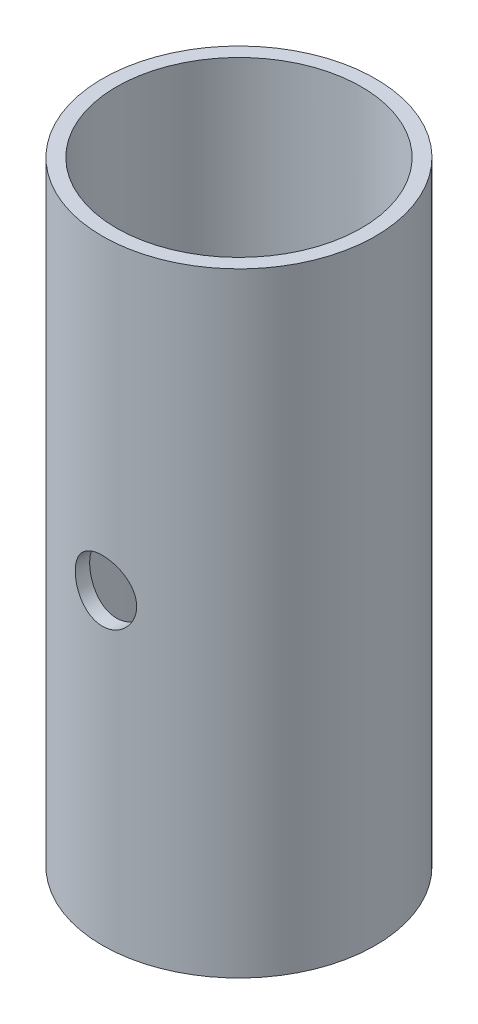
ISO-10303-21;
HEADER;
FILE_DESCRIPTION(('STEP AP214'),'2;1');
FILE_NAME('part.step','',(''),(''),'','','');
FILE_SCHEMA(('AUTOMOTIVE_DESIGN { 1 0 10303 214 1 1 1 1 }'));
ENDSEC;
DATA;
#1=APPLICATION_CONTEXT('core data for automotive mechanical design processes');
#2=APPLICATION_PROTOCOL_DEFINITION('international standard','automotive_design',2000,#1);
#3=PRODUCT_CONTEXT('',#1,'mechanical');
#4=PRODUCT('Part','Part','',(#3));
#5=PRODUCT_RELATED_PRODUCT_CATEGORY('part','',(#4));
#6=PRODUCT_DEFINITION_FORMATION('','',#4);
#7=PRODUCT_DEFINITION_CONTEXT('part definition',#1,'design');
#8=PRODUCT_DEFINITION('design','',#6,#7);
#9=PRODUCT_DEFINITION_SHAPE('','',#8);
#10=(LENGTH_UNIT() NAMED_UNIT(*) SI_UNIT(.MILLI.,.METRE.));
#11=(NAMED_UNIT(*) PLANE_ANGLE_UNIT() SI_UNIT($,.RADIAN.));
#12=(NAMED_UNIT(*) SI_UNIT($,.STERADIAN.) SOLID_ANGLE_UNIT());
#13=UNCERTAINTY_MEASURE_WITH_UNIT(LENGTH_MEASURE(1.E-05),#10,'distance_accuracy_value','');
#14=(GEOMETRIC_REPRESENTATION_CONTEXT(3) GLOBAL_UNCERTAINTY_ASSIGNED_CONTEXT((#13)) GLOBAL_UNIT_ASSIGNED_CONTEXT((#10,
#11,#12)) REPRESENTATION_CONTEXT('',''));
#15=CARTESIAN_POINT('',(0.,0.,0.));
#16=DIRECTION('',(0.,0.,1.));
#17=DIRECTION('',(1.,0.,0.));
#18=AXIS2_PLACEMENT_3D('',#15,#16,#17);
#19=CARTESIAN_POINT('',(0.,25.,0.));
#20=DIRECTION('',(0.,1.,0.));
#21=DIRECTION('',(0.,0.,1.));
#22=AXIS2_PLACEMENT_3D('',#19,#20,#21);
#23=PLANE('',#22);
#24=CARTESIAN_POINT('',(0.,25.,0.));
#25=DIRECTION('',(0.,1.,0.));
#26=DIRECTION('',(0.,0.,1.));
#27=AXIS2_PLACEMENT_3D('',#24,#25,#26);
#28=CIRCLE('',#27,11.1125);
#29=CARTESIAN_POINT('',(0.,25.,11.1125));
#30=VERTEX_POINT('',#29);
#31=EDGE_CURVE('E10',#30,#30,#28,.T.);
#32=ORIENTED_EDGE('',*,*,#31,.T.);
#33=EDGE_LOOP('',(#32));
#34=FACE_BOUND('',#33,.T.);
#35=CARTESIAN_POINT('',(0.,25.,0.));
#36=DIRECTION('',(0.,1.,0.));
#37=DIRECTION('',(0.,0.,1.));
#38=AXIS2_PLACEMENT_3D('',#35,#36,#37);
#39=CIRCLE('',#38,9.9695);
#40=CARTESIAN_POINT('',(0.,25.,9.9695));
#41=VERTEX_POINT('',#40);
#42=EDGE_CURVE('E57',#41,#41,#39,.T.);
#43=ORIENTED_EDGE('',*,*,#42,.F.);
#44=EDGE_LOOP('',(#43));
#45=FACE_BOUND('',#44,.T.);
#46=ADVANCED_FACE('F36',(#34,#45),#23,.T.);
#47=CARTESIAN_POINT('',(0.,-25.,0.));
#48=DIRECTION('',(0.,1.,0.));
#49=DIRECTION('',(0.,0.,1.));
#50=AXIS2_PLACEMENT_3D('',#47,#48,#49);
#51=PLANE('',#50);
#52=CARTESIAN_POINT('',(0.,-25.,0.));
#53=DIRECTION('',(0.,1.,0.));
#54=DIRECTION('',(0.,0.,1.));
#55=AXIS2_PLACEMENT_3D('',#52,#53,#54);
#56=CIRCLE('',#55,11.1125);
#57=CARTESIAN_POINT('',(0.,-25.,11.1125));
#58=VERTEX_POINT('',#57);
#59=EDGE_CURVE('E51',#58,#58,#56,.T.);
#60=ORIENTED_EDGE('',*,*,#59,.F.);
#61=EDGE_LOOP('',(#60));
#62=FACE_BOUND('',#61,.T.);
#63=CARTESIAN_POINT('',(0.,-25.,0.));
#64=DIRECTION('',(0.,1.,0.));
#65=DIRECTION('',(0.,0.,1.));
#66=AXIS2_PLACEMENT_3D('',#63,#64,#65);
#67=CIRCLE('',#66,9.9695);
#68=CARTESIAN_POINT('',(0.,-25.,9.9695));
#69=VERTEX_POINT('',#68);
#70=EDGE_CURVE('E60',#69,#69,#67,.T.);
#71=ORIENTED_EDGE('',*,*,#70,.T.);
#72=EDGE_LOOP('',(#71));
#73=FACE_BOUND('',#72,.T.);
#74=ADVANCED_FACE('F101',(#62,#73),#51,.F.);
#75=CARTESIAN_POINT('',(0.,25.,0.));
#76=DIRECTION('',(0.,-1.,0.));
#77=DIRECTION('',(0.,0.,-1.));
#78=AXIS2_PLACEMENT_3D('',#75,#76,#77);
#79=CYLINDRICAL_SURFACE('',#78,11.1125);
#80=CARTESIAN_POINT('',(0.,2.5,-11.1125));
#81=CARTESIAN_POINT('',(-0.138555992326033,2.49999541129345,-11.1124974631548));
#82=CARTESIAN_POINT('',(-0.277166585373073,2.48844247378652,-11.1098823887733));
#83=CARTESIAN_POINT('',(-0.550443832681169,2.44258794855994,-11.0997030655331));
#84=CARTESIAN_POINT('',(-0.685107713248079,2.40827074463278,-11.0921354192753));
#85=CARTESIAN_POINT('',(-0.946503210570984,2.31802228685091,-11.0728926834587));
#86=CARTESIAN_POINT('',(-1.07324318245969,2.26211426113627,-11.0612220092822));
#87=CARTESIAN_POINT('',(-1.31554076120525,2.13034646951837,-11.0350296246636));
#88=CARTESIAN_POINT('',(-1.43109852771982,2.05448698853628,-11.0205079549365));
#89=CARTESIAN_POINT('',(-1.64970991794908,1.88361200061934,-10.9899270153815));
#90=CARTESIAN_POINT('',(-1.75254730132298,1.78832339706377,-10.9738477648041));
#91=CARTESIAN_POINT('',(-1.94092288298333,1.58188104749059,-10.9421031159865));
#92=CARTESIAN_POINT('',(-2.02645946646052,1.47072582217606,-10.9264377564963));
#93=CARTESIAN_POINT('',(-2.17877132181193,1.23409147609866,-10.8970967953332));
#94=CARTESIAN_POINT('',(-2.24531417525413,1.10845930368358,-10.8834467546879));
#95=CARTESIAN_POINT('',(-2.35625811425181,0.847437540767664,-10.8599696624817));
#96=CARTESIAN_POINT('',(-2.40066201278112,0.712049192389005,-10.8501421252688));
#97=CARTESIAN_POINT('',(-2.46534852629385,0.437710300494672,-10.835626626895));
#98=CARTESIAN_POINT('',(-2.48601516456453,0.298854724228326,-10.8308569397498));
#99=CARTESIAN_POINT('',(-2.50383499773336,0.019571655269597,-10.8267518949985));
#100=CARTESIAN_POINT('',(-2.5009912567731,-0.120855630197317,-10.8274158292208));
#101=CARTESIAN_POINT('',(-2.47217958973819,-0.396424606247161,-10.8340291196128));
#102=CARTESIAN_POINT('',(-2.44665990600708,-0.531615995701498,-10.8398760172296));
#103=CARTESIAN_POINT('',(-2.37393184146332,-0.795748010376023,-10.8560342019669));
#104=CARTESIAN_POINT('',(-2.32672218084588,-0.92468826625524,-10.8663457525197));
#105=CARTESIAN_POINT('',(-2.21154838365679,-1.17390689107142,-10.8903710315134));
#106=CARTESIAN_POINT('',(-2.14341374422708,-1.29410367522852,-10.9041125291973));
#107=CARTESIAN_POINT('',(-1.98844383695694,-1.52152288567204,-10.9334326151613));
#108=CARTESIAN_POINT('',(-1.90160588075033,-1.62874344332526,-10.9490114673921));
#109=CARTESIAN_POINT('',(-1.70933121622004,-1.82974510940521,-10.9806889905219));
#110=CARTESIAN_POINT('',(-1.60351387817095,-1.92316190431572,-10.996791392153));
#111=CARTESIAN_POINT('',(-1.37753032524349,-2.09098501094489,-11.0273771610764));
#112=CARTESIAN_POINT('',(-1.25736382046168,-2.16539093848204,-11.0418604956464));
#113=CARTESIAN_POINT('',(-1.00563416097162,-2.29317836417965,-11.0676276288774));
#114=CARTESIAN_POINT('',(-0.874044847898022,-2.34650996537066,-11.0789038166204));
#115=CARTESIAN_POINT('',(-0.603461619575818,-2.43020173210578,-11.0969298689283));
#116=CARTESIAN_POINT('',(-0.464468848461796,-2.46056543616007,-11.1036804307079));
#117=CARTESIAN_POINT('',(-0.186147210849456,-2.4969246035578,-11.1117946352942));
#118=CARTESIAN_POINT('',(-0.0468864334475529,-2.50341741837312,-11.1132682073551));
#119=CARTESIAN_POINT('',(0.230730088163246,-2.49320158961574,-11.1109714086828));
#120=CARTESIAN_POINT('',(0.369085896788945,-2.47649461589419,-11.1072014153656));
#121=CARTESIAN_POINT('',(0.639301922297234,-2.42076548741272,-11.0949106723707));
#122=CARTESIAN_POINT('',(0.771219123199441,-2.38200618597168,-11.0864459115174));
#123=CARTESIAN_POINT('',(1.02667860197254,-2.28356599444063,-11.0657140006811));
#124=CARTESIAN_POINT('',(1.15022013740775,-2.22388325254127,-11.0534465141527));
#125=CARTESIAN_POINT('',(1.3874633269752,-2.08426795615611,-11.0262000240308));
#126=CARTESIAN_POINT('',(1.50099011000736,-2.00404579744773,-11.0111831985627));
#127=CARTESIAN_POINT('',(1.71314857714864,-1.82600805349406,-10.9801773211882));
#128=CARTESIAN_POINT('',(1.81177820326771,-1.72819004152531,-10.9641881353809));
#129=CARTESIAN_POINT('',(1.99332507352704,-1.51544931127397,-10.9326567969887));
#130=CARTESIAN_POINT('',(2.07589698003005,-1.40022926742464,-10.917129520444));
#131=CARTESIAN_POINT('',(2.22052205144228,-1.1572662861001,-10.8886359675843));
#132=CARTESIAN_POINT('',(2.28257611900287,-1.02952389984708,-10.8756695786172));
#133=CARTESIAN_POINT('',(2.38397366551675,-0.765835068780326,-10.8538941074407));
#134=CARTESIAN_POINT('',(2.42344729278772,-0.629940731414532,-10.845061255314));
#135=CARTESIAN_POINT('',(2.47893893709957,-0.353222152123477,-10.832513201275));
#136=CARTESIAN_POINT('',(2.49496095688096,-0.212398755696515,-10.8287971260334));
#137=CARTESIAN_POINT('',(2.50291661998489,0.0666928675989908,-10.8269606516042));
#138=CARTESIAN_POINT('',(2.49539856007537,0.204944905573266,-10.8287128812003));
#139=CARTESIAN_POINT('',(2.45771875527241,0.478157473600125,-10.8373263026618));
#140=CARTESIAN_POINT('',(2.42755730991031,0.613118047168492,-10.8441874269458));
#141=CARTESIAN_POINT('',(2.34571866458706,0.875450635748515,-10.8621817220002));
#142=CARTESIAN_POINT('',(2.29412565438591,1.00285013915913,-10.8732981633149));
#143=CARTESIAN_POINT('',(2.17095916299175,1.24726487452649,-10.8985562039653));
#144=CARTESIAN_POINT('',(2.09938346284486,1.3642789513431,-10.9126981392225));
#145=CARTESIAN_POINT('',(1.93648377737914,1.58729420571333,-10.9427909394528));
#146=CARTESIAN_POINT('',(1.84477094420327,1.69300706619528,-10.9587739678729));
#147=CARTESIAN_POINT('',(1.64498282537888,1.8877217183867,-10.9905368098804));
#148=CARTESIAN_POINT('',(1.53690374872705,1.97671962759168,-11.0063165754635));
#149=CARTESIAN_POINT('',(1.30563978768685,2.13666705959719,-11.0361554595477));
#150=CARTESIAN_POINT('',(1.18226582020213,2.20734852416113,-11.0501876132581));
#151=CARTESIAN_POINT('',(0.925095400979659,2.32685799162868,-11.0746774437788));
#152=CARTESIAN_POINT('',(0.791307559397397,2.3757038274836,-11.0851380357941));
#153=CARTESIAN_POINT('',(0.547875681495002,2.44172136971563,-11.0994993078687));
#154=CARTESIAN_POINT('',(0.439521644770601,2.46353314942903,-11.1043437637138));
#155=CARTESIAN_POINT('',(0.220789896038769,2.49267393555125,-11.110845041908));
#156=CARTESIAN_POINT('',(0.110412284164944,2.50000365664136,-11.1125020215572));
#157=CARTESIAN_POINT('',(0.,2.5,-11.1125));
#158=B_SPLINE_CURVE_WITH_KNOTS('',3,(#80,#81,#82,#83,#84,#85,#86,#87,#88,#89,#90,#91,#92,#93,
#94,#95,#96,#97,#98,#99,#100,#101,#102,#103,#104,#105,#106,#107,#108,#109,#110,#111,#112,#113,
#114,#115,#116,#117,#118,#119,#120,#121,#122,#123,#124,#125,#126,#127,#128,#129,#130,#131,#132,
#133,#134,#135,#136,#137,#138,#139,#140,#141,#142,#143,#144,#145,#146,#147,#148,#149,#150,#151,
#152,#153,#154,#155,#156,#157),.UNSPECIFIED.,.T.,.F.,(4,2,2,2,2,2,2,2,2,2,2,2,2,2,2,2,2,2,2,2,2,
2,2,2,2,2,2,2,2,2,2,2,2,2,2,2,2,2,4),(0.,0.41526373790139,0.830812640284414,1.24591572088795,
1.66101287384187,2.08240599568609,2.50383843107831,2.93022601729809,3.35655941293048,
3.77589384708033,4.19517362963085,4.6063453181846,5.01754127080734,5.43218089554961,
5.84688015933656,6.27108332594317,6.69529506439064,7.12050526144013,7.54564993585036,
7.96188481900489,8.37808974437475,8.78943462805624,9.20081592662269,9.6183520267996,
10.0359457554731,10.4617133437175,10.887462198466,11.3107317501847,11.7339290494648,
12.147343154169,12.5607517902427,12.972551562163,13.3843970800968,13.8050317443062,
14.2257639919094,14.652344220525,15.0785754257743,15.4095064805269,15.7404212036136),.UNSPECIFIED.);
#159=CARTESIAN_POINT('',(0.,2.5,-11.1125));
#160=VERTEX_POINT('',#159);
#161=EDGE_CURVE('E87',#160,#160,#158,.T.);
#162=ORIENTED_EDGE('',*,*,#161,.T.);
#163=EDGE_LOOP('',(#162));
#164=FACE_BOUND('',#163,.T.);
#165=CARTESIAN_POINT('',(2.5,0.,10.8276339174355));
#166=CARTESIAN_POINT('',(2.49999537652627,-0.13850596936511,10.8276367116591));
#167=CARTESIAN_POINT('',(2.48845049567496,-0.277066623265938,10.8303205104467));
#168=CARTESIAN_POINT('',(2.44263086850967,-0.550240218793963,10.8407445660957));
#169=CARTESIAN_POINT('',(2.40834030278654,-0.684850344778151,10.8484883420675));
#170=CARTESIAN_POINT('',(2.31816970642909,-0.946131923999044,10.8681119482357));
#171=CARTESIAN_POINT('',(2.26231415102122,-1.07281218850603,10.8799870880271));
#172=CARTESIAN_POINT('',(2.13067009226508,-1.31500887642987,10.9065297157517));
#173=CARTESIAN_POINT('',(2.05488175642686,-1.43052539365287,10.9211971802188));
#174=CARTESIAN_POINT('',(1.88408012704316,-1.64917980560476,10.9519645835611));
#175=CARTESIAN_POINT('',(1.78877773782143,-1.75208921017904,10.9680837386177));
#176=CARTESIAN_POINT('',(1.58227712653095,-1.94060480663927,10.9997703692592));
#177=CARTESIAN_POINT('',(1.47107762512464,-2.02620960457824,11.0153378003176));
#178=CARTESIAN_POINT('',(1.23440097403933,-2.17859572812336,11.0443768804665));
#179=CARTESIAN_POINT('',(1.10877837215244,-2.24515638700373,11.0578232094259));
#180=CARTESIAN_POINT('',(0.847777233635142,-2.35613584050972,11.0808875744405));
#181=CARTESIAN_POINT('',(0.712399858562281,-2.40055726641199,11.0905060654117));
#182=CARTESIAN_POINT('',(0.438109125652416,-2.46527612651572,11.1046952077655));
#183=CARTESIAN_POINT('',(0.299291329552314,-2.48596053548588,11.1093467433672));
#184=CARTESIAN_POINT('',(0.020083313925518,-2.50382902302956,11.1133584213887));
#185=CARTESIAN_POINT('',(-0.120306713688043,-2.5010159392438,11.1127192027388));
#186=CARTESIAN_POINT('',(-0.396003290214712,-2.47225563362395,11.1062829070091));
#187=CARTESIAN_POINT('',(-0.531355855233295,-2.44672562795758,11.1005788540151));
#188=CARTESIAN_POINT('',(-0.795804757464437,-2.37392211984568,11.0847602173487));
#189=CARTESIAN_POINT('',(-0.924900800979602,-2.3266475977467,11.0746454268471));
#190=CARTESIAN_POINT('',(-1.1743190449373,-2.21133402120238,11.050993596679));
#191=CARTESIAN_POINT('',(-1.2945664555784,-2.14313867055253,11.0374309338338));
#192=CARTESIAN_POINT('',(-1.5220617731888,-1.98803615297896,11.0083675418536));
#193=CARTESIAN_POINT('',(-1.62930781057751,-1.90112629991083,10.9928665346368));
#194=CARTESIAN_POINT('',(-1.83023901859358,-1.70879679828286,10.9612257126243));
#195=CARTESIAN_POINT('',(-1.92357401259731,-1.60301205445122,10.9450793463853));
#196=CARTESIAN_POINT('',(-2.09124708985444,-1.37712410272566,10.9142856152256));
#197=CARTESIAN_POINT('',(-2.16558459595419,-1.25702045997861,10.899638295855));
#198=CARTESIAN_POINT('',(-2.29332081099221,-1.0053152263596,10.8734824670189));
#199=CARTESIAN_POINT('',(-2.34664994523003,-0.873677166511487,10.8619844248793));
#200=CARTESIAN_POINT('',(-2.43032221839375,-0.602986962733878,10.8435715918315));
#201=CARTESIAN_POINT('',(-2.46066923852538,-0.463936074925888,10.836656027062));
#202=CARTESIAN_POINT('',(-2.49696558960774,-0.185576179121167,10.8283499024271));
#203=CARTESIAN_POINT('',(-2.50342629502818,-0.0463372273221378,10.8268435587902));
#204=CARTESIAN_POINT('',(-2.49315406650213,0.231228252401871,10.8292135561527));
#205=CARTESIAN_POINT('',(-2.47642282602919,0.36955484620611,10.8330895041377));
#206=CARTESIAN_POINT('',(-2.42068626422912,0.639566310650687,10.8456777135215));
#207=CARTESIAN_POINT('',(-2.38196561185851,0.771313094780377,10.8543281265197));
#208=CARTESIAN_POINT('',(-2.283658975485,1.02644862773876,10.8754342336767));
#209=CARTESIAN_POINT('',(-2.22407090015643,1.14983653736429,10.8878903092217));
#210=CARTESIAN_POINT('',(-2.0846050439819,1.38695602842956,10.9154566197787));
#211=CARTESIAN_POINT('',(-2.00441400391232,1.50049864347419,10.9306066082441));
#212=CARTESIAN_POINT('',(-1.82642578444819,1.71270326695081,10.9617503118516));
#213=CARTESIAN_POINT('',(-1.728626285534,1.8113633117874,10.9777441379539));
#214=CARTESIAN_POINT('',(-1.51587692439189,1.99300342838099,11.0091571326396));
#215=CARTESIAN_POINT('',(-1.400625494173,2.07563386790355,11.0245586225526));
#216=CARTESIAN_POINT('',(-1.15758145037633,2.22036161966554,11.0527193400043));
#217=CARTESIAN_POINT('',(-1.0297894400694,2.28245991898652,11.0654786945525));
#218=CARTESIAN_POINT('',(-0.766110046079093,2.38388189903798,11.0868433288369));
#219=CARTESIAN_POINT('',(-0.630282201146034,2.42335440411948,11.0954756905728));
#220=CARTESIAN_POINT('',(-0.35370607266109,2.47886622322205,11.1077311067478));
#221=CARTESIAN_POINT('',(-0.21295855161365,2.49490915226613,11.1113549339647));
#222=CARTESIAN_POINT('',(0.0661493537248791,2.50293603458295,11.1131603888966));
#223=CARTESIAN_POINT('',(0.20449425211184,2.49544079016073,11.1114598258464));
#224=CARTESIAN_POINT('',(0.477898716707944,2.45777431077498,11.1030616598101));
#225=CARTESIAN_POINT('',(0.612958348699964,2.42760353024393,11.096364156966));
#226=CARTESIAN_POINT('',(0.875528340610918,2.34569800965344,11.0787352223085));
#227=CARTESIAN_POINT('',(1.00306405435748,2.29404104856645,11.0678190718041));
#228=CARTESIAN_POINT('',(1.24772525932194,2.17070390120429,11.0429152550813));
#229=CARTESIAN_POINT('',(1.36484967642534,2.09902165210977,11.028927272463));
#230=CARTESIAN_POINT('',(1.58789101874578,1.93599133819042,10.999053864346));
#231=CARTESIAN_POINT('',(1.69353765899212,1.84427938572255,10.9831361453931));
#232=CARTESIAN_POINT('',(1.88811914279006,1.64452192067796,10.9513654346704));
#233=CARTESIAN_POINT('',(1.97704991965211,1.53647244496244,10.9355124595669));
#234=CARTESIAN_POINT('',(2.13690796459927,1.3052443883283,10.9054119117939));
#235=CARTESIAN_POINT('',(2.20755900512756,1.18187120955277,10.8911905974708));
#236=CARTESIAN_POINT('',(2.32701179816577,0.924706032093411,10.866297598077));
#237=CARTESIAN_POINT('',(2.37583156318628,0.790922729982531,10.8556229885734));
#238=CARTESIAN_POINT('',(2.4417897791808,0.547556253721866,10.8409489116579));
#239=CARTESIAN_POINT('',(2.46357571309892,0.43926659855099,10.8359897349645));
#240=CARTESIAN_POINT('',(2.4926822704784,0.220662791898773,10.8293312137358));
#241=CARTESIAN_POINT('',(2.50000368355642,0.110348751260253,10.8276316912565));
#242=CARTESIAN_POINT('',(2.5,0.,10.8276339174355));
#243=B_SPLINE_CURVE_WITH_KNOTS('',3,(#165,#166,#167,#168,#169,#170,#171,#172,#173,#174,#175,
#176,#177,#178,#179,#180,#181,#182,#183,#184,#185,#186,#187,#188,#189,#190,#191,#192,#193,#194,
#195,#196,#197,#198,#199,#200,#201,#202,#203,#204,#205,#206,#207,#208,#209,#210,#211,#212,#213,
#214,#215,#216,#217,#218,#219,#220,#221,#222,#223,#224,#225,#226,#227,#228,#229,#230,#231,#232,
#233,#234,#235,#236,#237,#238,#239,#240,#241,#242),.UNSPECIFIED.,.T.,.F.,(4,2,2,2,2,2,2,2,2,2,2,
2,2,2,2,2,2,2,2,2,2,2,2,2,2,2,2,2,2,2,2,2,2,2,2,2,2,2,4),(0.,0.415113342660895,
0.830515695867281,1.24544796676738,1.66037675079304,2.0819665841248,2.50359036448029,
2.92991814594734,3.35619524571271,3.77541953224851,4.19459319250151,4.6062237069072,
5.01787352564072,5.43267686437885,5.84753978072318,6.27152810325198,6.69552930523761,
7.1209231247774,7.54624508803249,7.96240693505505,8.37853839558224,8.78940167795954,
9.200306148698,9.61787184433033,10.0354925851771,10.4613926646517,10.8872722660247,
11.3103174535866,11.7332973612768,12.1469849397086,12.5606642277933,12.9728588723034,
13.3850959929473,13.8055593128619,14.2261247924364,14.6527164727302,15.0789555291475,
15.409697518262,15.7404214517075),.UNSPECIFIED.);
#244=CARTESIAN_POINT('',(2.5,0.,10.8276339174355));
#245=VERTEX_POINT('',#244);
#246=EDGE_CURVE('E81',#245,#245,#243,.T.);
#247=ORIENTED_EDGE('',*,*,#246,.T.);
#248=EDGE_LOOP('',(#247));
#249=FACE_BOUND('',#248,.T.);
#250=ORIENTED_EDGE('',*,*,#31,.F.);
#251=EDGE_LOOP('',(#250));
#252=FACE_BOUND('',#251,.T.);
#253=ORIENTED_EDGE('',*,*,#59,.T.);
#254=EDGE_LOOP('',(#253));
#255=FACE_BOUND('',#254,.T.);
#256=ADVANCED_FACE('F38',(#164,#249,#252,#255),#79,.T.);
#257=CARTESIAN_POINT('',(0.,25.,0.));
#258=DIRECTION('',(0.,-1.,0.));
#259=DIRECTION('',(0.,0.,-1.));
#260=AXIS2_PLACEMENT_3D('',#257,#258,#259);
#261=CYLINDRICAL_SURFACE('',#260,9.9695);
#262=CARTESIAN_POINT('',(0.,2.5,-9.9695));
#263=CARTESIAN_POINT('',(-0.138113047728694,2.49999614905682,-9.96949767395087));
#264=CARTESIAN_POINT('',(-0.276269030762304,2.4885163765159,-9.96660138616661));
#265=CARTESIAN_POINT('',(-0.548620537432616,2.4429699330566,-9.9553281951035));
#266=CARTESIAN_POINT('',(-0.682813787088895,2.40889054688179,-9.9469482065565));
#267=CARTESIAN_POINT('',(-0.943267576179872,2.31930778101849,-9.92563543021387));
#268=CARTESIAN_POINT('',(-1.06953746092077,2.26383021371418,-9.91270812943697));
#269=CARTESIAN_POINT('',(-1.31097843856138,2.13311691501556,-9.88367702176381));
#270=CARTESIAN_POINT('',(-1.42614914027151,2.05788048757011,-9.86757310296887));
#271=CARTESIAN_POINT('',(-1.64450797398663,1.8881391956832,-9.83356368152395));
#272=CARTESIAN_POINT('',(-1.74743347662711,1.79330205913467,-9.81563024744559));
#273=CARTESIAN_POINT('',(-1.93609751948132,1.58776277333934,-9.78016829230078));
#274=CARTESIAN_POINT('',(-2.02183410744214,1.47705882444497,-9.76263981742788));
#275=CARTESIAN_POINT('',(-2.17492377697408,1.24088662437717,-9.72969062895764));
#276=CARTESIAN_POINT('',(-2.2419826981788,1.11522229949493,-9.71430536473121));
#277=CARTESIAN_POINT('',(-2.353921637457,0.853956041942622,-9.687792057014));
#278=CARTESIAN_POINT('',(-2.39880522526488,0.71835571278613,-9.67666332838104));
#279=CARTESIAN_POINT('',(-2.46422275246687,0.443955415261059,-9.66021025295185));
#280=CARTESIAN_POINT('',(-2.48522908028218,0.305274963627661,-9.6547734742758));
#281=CARTESIAN_POINT('',(-2.50376726823541,0.0262600068016351,-9.64998336003904));
#282=CARTESIAN_POINT('',(-2.50130297234493,-0.114074223778353,-9.65062902830722));
#283=CARTESIAN_POINT('',(-2.4733466801853,-0.388789706665756,-9.65782980756662));
#284=CARTESIAN_POINT('',(-2.44841797954518,-0.523232664088417,-9.66424035591649));
#285=CARTESIAN_POINT('',(-2.37713925396767,-0.785964565774579,-9.68201815633546));
#286=CARTESIAN_POINT('',(-2.33078769463386,-0.914253068503206,-9.69338576344693));
#287=CARTESIAN_POINT('',(-2.2174999015248,-1.16254299808383,-9.71992927861286));
#288=CARTESIAN_POINT('',(-2.1503595436895,-1.28244711399161,-9.73514266340429));
#289=CARTESIAN_POINT('',(-1.9975427671576,-1.50948884911542,-9.7676424561665));
#290=CARTESIAN_POINT('',(-1.9118630866064,-1.61662421661541,-9.78492922869541));
#291=CARTESIAN_POINT('',(-1.72148367523873,-1.81831486427458,-9.82023638185772));
#292=CARTESIAN_POINT('',(-1.61630869918667,-1.91242092491346,-9.8382635791419));
#293=CARTESIAN_POINT('',(-1.39145396498396,-2.08174529046015,-9.87257315495588));
#294=CARTESIAN_POINT('',(-1.27177375858216,-2.15696301144601,-9.88885547953503));
#295=CARTESIAN_POINT('',(-1.02066244164433,-2.28654196457201,-9.9179225854416));
#296=CARTESIAN_POINT('',(-0.889191964678099,-2.34082985665154,-9.93069502370909));
#297=CARTESIAN_POINT('',(-0.618599241670961,-2.42640893342156,-9.95121350368263));
#298=CARTESIAN_POINT('',(-0.479478474089644,-2.45770454482263,-9.95896051290238));
#299=CARTESIAN_POINT('',(-0.201374742591494,-2.49572377917882,-9.96841194205939));
#300=CARTESIAN_POINT('',(-0.0624803918813529,-2.50305910498374,-9.97026675434755));
#301=CARTESIAN_POINT('',(0.214551443847166,-2.49462779955208,-9.96815332839581));
#302=CARTESIAN_POINT('',(0.352688996303538,-2.47886326148384,-9.96418561775725));
#303=CARTESIAN_POINT('',(0.622157814805205,-2.42518382059059,-9.95096937261768));
#304=CARTESIAN_POINT('',(0.753559886412691,-2.3876029616724,-9.94180052346175));
#305=CARTESIAN_POINT('',(1.00818757720862,-2.29173950020259,-9.91921573654709));
#306=CARTESIAN_POINT('',(1.13141236623377,-2.23345479958706,-9.9057993683728));
#307=CARTESIAN_POINT('',(1.36861879009435,-2.09665491193951,-9.87584793932349));
#308=CARTESIAN_POINT('',(1.48239645075042,-2.01779755190317,-9.85926153840859));
#309=CARTESIAN_POINT('',(1.69532091519747,-1.8425278675844,-9.82489029377236));
#310=CARTESIAN_POINT('',(1.79446517224871,-1.74611249408159,-9.80710524222529));
#311=CARTESIAN_POINT('',(1.97783180098737,-1.5356228599699,-9.77179928831369));
#312=CARTESIAN_POINT('',(2.06162496526384,-1.42117114936418,-9.75429576956078));
#313=CARTESIAN_POINT('',(2.20881579970539,-1.17947024714259,-9.72202463965444));
#314=CARTESIAN_POINT('',(2.27221437389174,-1.05222162309768,-9.70725690724542));
#315=CARTESIAN_POINT('',(2.37634391707877,-0.789219822271333,-9.68229251215373));
#316=CARTESIAN_POINT('',(2.41720915654158,-0.653522504417917,-9.67206884494439));
#317=CARTESIAN_POINT('',(2.47546442419684,-0.376887722874578,-9.65732499513074));
#318=CARTESIAN_POINT('',(2.49285962393905,-0.235951420613688,-9.65280355607265));
#319=CARTESIAN_POINT('',(2.50340956829891,0.0427918654478139,-9.65007227786826));
#320=CARTESIAN_POINT('',(2.49725048444394,0.180571542529445,-9.65168377051115));
#321=CARTESIAN_POINT('',(2.46243806081548,0.453060475346853,-9.66062346091926));
#322=CARTESIAN_POINT('',(2.4337851784742,0.587769793463897,-9.66795154243233));
#323=CARTESIAN_POINT('',(2.35517432620656,0.849542795036526,-9.68739883247829));
#324=CARTESIAN_POINT('',(2.30534580016833,0.976647664706508,-9.69948889930271));
#325=CARTESIAN_POINT('',(2.18590043559971,1.22078430272815,-9.72710185314404));
#326=CARTESIAN_POINT('',(2.11628083584868,1.33781466252905,-9.74262521910251));
#327=CARTESIAN_POINT('',(1.95708155275026,1.56179418742245,-9.77586456175542));
#328=CARTESIAN_POINT('',(1.86702610623766,1.66839829560187,-9.79362737959516));
#329=CARTESIAN_POINT('',(1.67043761248093,1.86520474383546,-9.82906538745124));
#330=CARTESIAN_POINT('',(1.56390065423722,1.95540317980462,-9.84674055563857));
#331=CARTESIAN_POINT('',(1.33502637598232,2.11844371217044,-9.88039676457801));
#332=CARTESIAN_POINT('',(1.2124361531584,2.19093896220918,-9.8963409947406));
#333=CARTESIAN_POINT('',(0.95641945416349,2.31417650693129,-9.92434987224817));
#334=CARTESIAN_POINT('',(0.823000788190833,2.36493431714175,-9.93641728520578));
#335=CARTESIAN_POINT('',(0.574859699729584,2.43576241520842,-9.95353879115598));
#336=CARTESIAN_POINT('',(0.46131447582176,2.45979926882378,-9.95948301946293));
#337=CARTESIAN_POINT('',(0.23185613314336,2.49191907001714,-9.96746445142397));
#338=CARTESIAN_POINT('',(0.115943195413038,2.50000323279129,-9.96950195267264));
#339=CARTESIAN_POINT('',(0.,2.5,-9.9695));
#340=B_SPLINE_CURVE_WITH_KNOTS('',3,(#262,#263,#264,#265,#266,#267,#268,#269,#270,#271,#272,
#273,#274,#275,#276,#277,#278,#279,#280,#281,#282,#283,#284,#285,#286,#287,#288,#289,#290,#291,
#292,#293,#294,#295,#296,#297,#298,#299,#300,#301,#302,#303,#304,#305,#306,#307,#308,#309,#310,
#311,#312,#313,#314,#315,#316,#317,#318,#319,#320,#321,#322,#323,#324,#325,#326,#327,#328,#329,
#330,#331,#332,#333,#334,#335,#336,#337,#338,#339),.UNSPECIFIED.,.T.,.F.,(4,2,2,2,2,2,2,2,2,2,2,
2,2,2,2,2,2,2,2,2,2,2,2,2,2,2,2,2,2,2,2,2,2,2,2,2,2,2,4),(0.,0.413914240262191,
0.828061559556461,1.24171085219935,1.65537471854197,2.07673042144831,2.49813395328909,
2.92584077926066,3.35347873151483,3.77250040979668,4.19145346273026,4.60018491912269,
5.00894565514113,5.42185458158153,5.83483621540417,6.25966876136378,6.68451443915619,
7.11083557059699,7.5370746007797,7.95234307926972,8.36757393099802,8.77660859899571,
9.1856847291443,9.60205452120171,10.0184966913848,10.4452281331709,10.8719406568288,
11.2960822463228,11.720130362274,12.1319207315035,12.5437027268116,12.9530029630623,
13.3623603323127,13.7824578904581,14.2026552894883,14.6305223379245,15.05808347673,
15.40558283708,15.7530557256461),.UNSPECIFIED.);
#341=CARTESIAN_POINT('',(0.,2.5,-9.9695));
#342=VERTEX_POINT('',#341);
#343=EDGE_CURVE('E41',#342,#342,#340,.T.);
#344=ORIENTED_EDGE('',*,*,#343,.F.);
#345=EDGE_LOOP('',(#344));
#346=FACE_BOUND('',#345,.T.);
#347=CARTESIAN_POINT('',(2.5,0.,9.65095488798906));
#348=CARTESIAN_POINT('',(2.49999610360627,-0.138036056008927,9.65095751472973));
#349=CARTESIAN_POINT('',(2.48852868728374,-0.276115143493432,9.65394868983175));
#350=CARTESIAN_POINT('',(2.44303576392108,-0.548307130634357,9.66555940539333));
#351=CARTESIAN_POINT('',(2.40899720977212,-0.682417689441584,9.67418220113344));
#352=CARTESIAN_POINT('',(2.31953376574772,-0.942696104961181,9.69601954943323));
#353=CARTESIAN_POINT('',(2.26413659334057,-1.0688740102147,9.70922814871022));
#354=CARTESIAN_POINT('',(2.13361295585348,-1.3101591764426,9.738741408645));
#355=CARTESIAN_POINT('',(2.05848562165914,-1.42526594942792,9.75504620568165));
#356=CARTESIAN_POINT('',(1.88885753152581,-1.64368980816395,9.7893188435868));
#357=CARTESIAN_POINT('',(1.79399994146508,-1.74672564151199,9.80731338737078));
#358=CARTESIAN_POINT('',(1.58837253498779,-1.93560465749294,9.84270639459187));
#359=CARTESIAN_POINT('',(1.47760122564241,-2.02144622525287,9.86010480191318));
#360=CARTESIAN_POINT('',(1.24136294593579,-2.17465166829603,9.89264075314641));
#361=CARTESIAN_POINT('',(1.11571143090011,-2.24173909996394,9.90774311235251));
#362=CARTESIAN_POINT('',(0.854472612600503,-2.35373419852417,9.9336806230292));
#363=CARTESIAN_POINT('',(0.718886787996011,-2.39864515857419,9.94451640802832));
#364=CARTESIAN_POINT('',(0.444560353004109,-2.46411117741394,9.9605110977076));
#365=CARTESIAN_POINT('',(0.305940324015265,-2.48514388343292,9.96578117977072));
#366=CARTESIAN_POINT('',(0.0270458619670139,-2.5037558150724,9.9704381509754));
#367=CARTESIAN_POINT('',(-0.11322832195504,-2.50133852862245,9.96982591504747));
#368=CARTESIAN_POINT('',(-0.38813593384689,-2.47346230554717,9.96286993419152));
#369=CARTESIAN_POINT('',(-0.522825378592018,-2.44851896586793,9.95665444718859));
#370=CARTESIAN_POINT('',(-0.786042411598888,-2.37712763414263,9.93933977554746));
#371=CARTESIAN_POINT('',(-0.914569670322464,-2.33067849343297,9.92824033004982));
#372=CARTESIAN_POINT('',(-1.16317041002127,-2.21717789569426,9.90220895176481));
#373=CARTESIAN_POINT('',(-1.2831565638758,-2.14994325376434,9.88724314512951));
#374=CARTESIAN_POINT('',(-1.5103236116529,-1.9969192362866,9.85510194148782));
#375=CARTESIAN_POINT('',(-1.61750226046516,-1.91112661497626,9.83792615817302));
#376=CARTESIAN_POINT('',(-1.81908692978719,-1.72065923344777,9.80268442689761));
#377=CARTESIAN_POINT('',(-1.91306573648631,-1.61553396742927,9.78460697499822));
#378=CARTESIAN_POINT('',(-2.08215600735034,-1.39082649292864,9.75002699201762));
#379=CARTESIAN_POINT('',(-2.15726657853862,-1.27124360060727,9.7335245354991));
#380=CARTESIAN_POINT('',(-2.28676407938667,-1.0201734142263,9.70392161426516));
#381=CARTESIAN_POINT('',(-2.34104756904148,-0.888630614396799,9.69083823060515));
#382=CARTESIAN_POINT('',(-2.42659646491883,-0.617878718384063,9.66977362480135));
#383=CARTESIAN_POINT('',(-2.45786683113497,-0.478671281107775,9.66179130328001));
#384=CARTESIAN_POINT('',(-2.49579177718404,-0.200505101442693,9.65206350339895));
#385=CARTESIAN_POINT('',(-2.50307826820826,-0.0616380098314385,9.65015796114917));
#386=CARTESIAN_POINT('',(-2.4945591045209,0.215328254610256,9.65236367957639));
#387=CARTESIAN_POINT('',(-2.47875559003223,0.353427497421987,9.65647438260498));
#388=CARTESIAN_POINT('',(-2.42505922003795,0.622587508587659,9.67009598217619));
#389=CARTESIAN_POINT('',(-2.38753481073084,0.753726777961183,9.67951673728773));
#390=CARTESIAN_POINT('',(-2.29187060303027,1.00785347142544,9.70261126748696));
#391=CARTESIAN_POINT('',(-2.23372835105489,1.13083992323928,9.71628554873254));
#392=CARTESIAN_POINT('',(-2.09715804110613,1.36784577766858,9.74668301226969));
#393=CARTESIAN_POINT('',(-2.01835248206933,1.48164046551889,9.76346101175083));
#394=CARTESIAN_POINT('',(-1.84316946647689,1.69462278598249,9.79804121173493));
#395=CARTESIAN_POINT('',(-1.74678910372145,1.79380799783661,9.81584358129576));
#396=CARTESIAN_POINT('',(-1.53629130020296,1.97731847548978,9.85100949672337));
#397=CARTESIAN_POINT('',(-1.42178819605377,2.06120644686992,9.8683506899683));
#398=CARTESIAN_POINT('',(-1.17995380457836,2.20856387044268,9.90017630545493));
#399=CARTESIAN_POINT('',(-1.05262318788321,2.27203438934687,9.91466087692579));
#400=CARTESIAN_POINT('',(-0.789629395154731,2.37620254147468,9.93904979925914));
#401=CARTESIAN_POINT('',(-0.654034428548809,2.41706431146188,9.94898706922246));
#402=CARTESIAN_POINT('',(-0.377619949615118,2.4753470824641,9.9633058739438));
#403=CARTESIAN_POINT('',(-0.236801457628259,2.49277263688905,9.96768848790345));
#404=CARTESIAN_POINT('',(0.0419555933700586,2.50343088505372,9.97035982095536));
#405=CARTESIAN_POINT('',(0.179868299320534,2.49730875234311,9.96881105655802));
#406=CARTESIAN_POINT('',(0.452633380640772,2.46252406993159,9.96015436128013));
#407=CARTESIAN_POINT('',(0.587485847921859,2.43386219811432,9.95304659758676));
#408=CARTESIAN_POINT('',(0.849622690277838,2.355158531901,9.93409599196245));
#409=CARTESIAN_POINT('',(0.976944285550242,2.30523403667524,9.92227915118919));
#410=CARTESIAN_POINT('',(1.22147574383582,2.18552863529698,9.89515434518313));
#411=CARTESIAN_POINT('',(1.33868432290031,2.11574521267478,9.87984593755723));
#412=CARTESIAN_POINT('',(1.56271928293175,1.95633875189908,9.84692739382001));
#413=CARTESIAN_POINT('',(1.66922768163706,1.86627842306138,9.82927070705402));
#414=CARTESIAN_POINT('',(1.86583889138573,1.66972275429819,9.79385405267647));
#415=CARTESIAN_POINT('',(1.95593753010575,1.56322324725092,9.7760940599797));
#416=CARTESIAN_POINT('',(2.11883531070457,1.33440218043817,9.74210130677624));
#417=CARTESIAN_POINT('',(2.19127735933323,1.21182079684397,9.7259035372626));
#418=CARTESIAN_POINT('',(2.31441769205894,0.955830498998411,9.6973411211262));
#419=CARTESIAN_POINT('',(2.3651317262705,0.82242951132597,9.68497369978454));
#420=CARTESIAN_POINT('',(2.43586691578481,0.574395310912132,9.66739556111032));
#421=CARTESIAN_POINT('',(2.4598642188529,0.46094415893229,9.6612768591262));
#422=CARTESIAN_POINT('',(2.49193170755105,0.231671971160359,9.65305559388673));
#423=CARTESIAN_POINT('',(2.50000327017211,0.115851141133286,9.65095268341359));
#424=CARTESIAN_POINT('',(2.5,0.,9.65095488798906));
#425=B_SPLINE_CURVE_WITH_KNOTS('',3,(#347,#348,#349,#350,#351,#352,#353,#354,#355,#356,#357,
#358,#359,#360,#361,#362,#363,#364,#365,#366,#367,#368,#369,#370,#371,#372,#373,#374,#375,#376,
#377,#378,#379,#380,#381,#382,#383,#384,#385,#386,#387,#388,#389,#390,#391,#392,#393,#394,#395,
#396,#397,#398,#399,#400,#401,#402,#403,#404,#405,#406,#407,#408,#409,#410,#411,#412,#413,#414,
#415,#416,#417,#418,#419,#420,#421,#422,#423,#424),.UNSPECIFIED.,.T.,.F.,(4,2,2,2,2,2,2,2,2,2,2,
2,2,2,2,2,2,2,2,2,2,2,2,2,2,2,2,2,2,2,2,2,2,2,2,2,2,2,4),(0.,0.413682701291605,
0.827604738046066,1.24099141884902,1.65439631240676,2.07605457218552,2.49775241525344,
2.9253728257259,3.35292971638816,3.77177437417431,4.19055673435997,4.59999000779762,
5.00944515232746,5.42261701880569,5.83586120693132,6.26035681469094,6.68487250876312,
7.11147012505548,7.53797577027672,7.95315017263487,8.36828609473352,8.77657834097624,
9.1849191914719,9.60131423100974,10.0177781888927,10.4447336242972,10.8716667497538,
11.2954583023587,11.7191675048263,12.1313514549555,12.5435230091084,12.9534496103578,
13.363428179548,13.783279440917,14.2032373045251,14.6310907463813,15.0586335206887,
15.4058598812564,15.7530562181948),.UNSPECIFIED.);
#426=CARTESIAN_POINT('',(2.5,0.,9.65095488798906));
#427=VERTEX_POINT('',#426);
#428=EDGE_CURVE('E62',#427,#427,#425,.T.);
#429=ORIENTED_EDGE('',*,*,#428,.F.);
#430=EDGE_LOOP('',(#429));
#431=FACE_BOUND('',#430,.T.);
#432=ORIENTED_EDGE('',*,*,#42,.T.);
#433=EDGE_LOOP('',(#432));
#434=FACE_BOUND('',#433,.T.);
#435=ORIENTED_EDGE('',*,*,#70,.F.);
#436=EDGE_LOOP('',(#435));
#437=FACE_BOUND('',#436,.T.);
#438=ADVANCED_FACE('F68',(#346,#431,#434,#437),#261,.F.);
#439=CARTESIAN_POINT('',(0.,0.,-11.1125));
#440=DIRECTION('',(0.,0.,1.));
#441=DIRECTION('',(1.,0.,0.));
#442=AXIS2_PLACEMENT_3D('',#439,#440,#441);
#443=CYLINDRICAL_SURFACE('',#442,2.5);
#444=ORIENTED_EDGE('',*,*,#428,.T.);
#445=EDGE_LOOP('',(#444));
#446=FACE_BOUND('',#445,.T.);
#447=ORIENTED_EDGE('',*,*,#246,.F.);
#448=EDGE_LOOP('',(#447));
#449=FACE_BOUND('',#448,.T.);
#450=ADVANCED_FACE('F74',(#446,#449),#443,.F.);
#451=ORIENTED_EDGE('',*,*,#343,.T.);
#452=EDGE_LOOP('',(#451));
#453=FACE_BOUND('',#452,.T.);
#454=ORIENTED_EDGE('',*,*,#161,.F.);
#455=EDGE_LOOP('',(#454));
#456=FACE_BOUND('',#455,.T.);
#457=ADVANCED_FACE('F71',(#453,#456),#443,.F.);
#458=CLOSED_SHELL('',(#46,#74,#256,#438,#450,#457));
#459=MANIFOLD_SOLID_BREP('B2',#458);
#460=ADVANCED_BREP_SHAPE_REPRESENTATION('',(#18,#459),#14);
#461=SHAPE_DEFINITION_REPRESENTATION(#9,#460);
ENDSEC;
END-ISO-10303-21;
